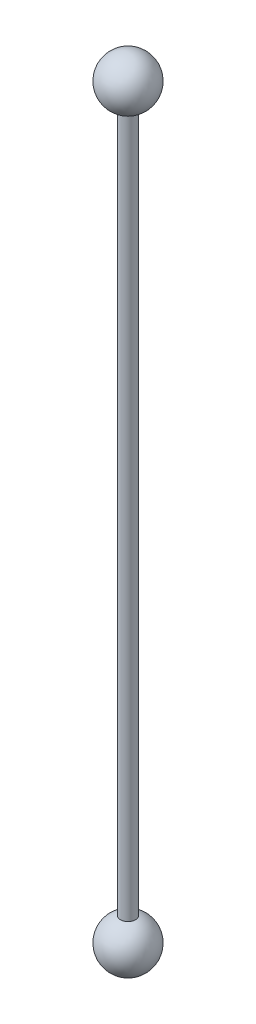
ISO-10303-21;
HEADER;
FILE_DESCRIPTION(('STEP AP214'),'2;1');
FILE_NAME('part.step','',(''),(''),'','','');
FILE_SCHEMA(('AUTOMOTIVE_DESIGN { 1 0 10303 214 1 1 1 1 }'));
ENDSEC;
DATA;
#1=APPLICATION_CONTEXT('core data for automotive mechanical design processes');
#2=APPLICATION_PROTOCOL_DEFINITION('international standard','automotive_design',2000,#1);
#3=PRODUCT_CONTEXT('',#1,'mechanical');
#4=PRODUCT('Part','Part','',(#3));
#5=PRODUCT_RELATED_PRODUCT_CATEGORY('part','',(#4));
#6=PRODUCT_DEFINITION_FORMATION('','',#4);
#7=PRODUCT_DEFINITION_CONTEXT('part definition',#1,'design');
#8=PRODUCT_DEFINITION('design','',#6,#7);
#9=PRODUCT_DEFINITION_SHAPE('','',#8);
#10=(LENGTH_UNIT() NAMED_UNIT(*) SI_UNIT(.MILLI.,.METRE.));
#11=(NAMED_UNIT(*) PLANE_ANGLE_UNIT() SI_UNIT($,.RADIAN.));
#12=(NAMED_UNIT(*) SI_UNIT($,.STERADIAN.) SOLID_ANGLE_UNIT());
#13=UNCERTAINTY_MEASURE_WITH_UNIT(LENGTH_MEASURE(1.E-05),#10,'distance_accuracy_value','');
#14=(GEOMETRIC_REPRESENTATION_CONTEXT(3) GLOBAL_UNCERTAINTY_ASSIGNED_CONTEXT((#13)) GLOBAL_UNIT_ASSIGNED_CONTEXT((#10,
#11,#12)) REPRESENTATION_CONTEXT('',''));
#15=CARTESIAN_POINT('',(0.,0.,0.));
#16=DIRECTION('',(0.,0.,1.));
#17=DIRECTION('',(1.,0.,0.));
#18=AXIS2_PLACEMENT_3D('',#15,#16,#17);
#19=CARTESIAN_POINT('',(0.,150.,0.));
#20=DIRECTION('',(0.,-1.,0.));
#21=DIRECTION('',(0.,0.,-1.));
#22=AXIS2_PLACEMENT_3D('',#19,#20,#21);
#23=CYLINDRICAL_SURFACE('',#22,1.5);
#24=CARTESIAN_POINT('',(0.,4.76969600708473,0.));
#25=DIRECTION('',(0.,-1.,0.));
#26=DIRECTION('',(0.,0.,-1.));
#27=AXIS2_PLACEMENT_3D('',#24,#25,#26);
#28=CIRCLE('',#27,1.5);
#29=CARTESIAN_POINT('',(0.,4.76969600708473,-1.5));
#30=VERTEX_POINT('',#29);
#31=EDGE_CURVE('E44',#30,#30,#28,.T.);
#32=ORIENTED_EDGE('',*,*,#31,.F.);
#33=EDGE_LOOP('',(#32));
#34=FACE_BOUND('',#33,.T.);
#35=CARTESIAN_POINT('',(0.,145.230303992915,0.));
#36=DIRECTION('',(0.,1.,0.));
#37=DIRECTION('',(0.,0.,1.));
#38=AXIS2_PLACEMENT_3D('',#35,#36,#37);
#39=CIRCLE('',#38,1.5);
#40=CARTESIAN_POINT('',(0.,145.230303992915,1.5));
#41=VERTEX_POINT('',#40);
#42=EDGE_CURVE('E10',#41,#41,#39,.T.);
#43=ORIENTED_EDGE('',*,*,#42,.F.);
#44=EDGE_LOOP('',(#43));
#45=FACE_BOUND('',#44,.T.);
#46=ADVANCED_FACE('F37',(#34,#45),#23,.T.);
#47=CARTESIAN_POINT('',(0.,0.,0.));
#48=DIRECTION('',(0.,1.,0.));
#49=DIRECTION('',(0.,0.,-1.));
#50=AXIS2_PLACEMENT_3D('',#47,#48,#49);
#51=SPHERICAL_SURFACE('',#50,5.);
#52=ORIENTED_EDGE('',*,*,#31,.T.);
#53=EDGE_LOOP('',(#52));
#54=FACE_BOUND('',#53,.T.);
#55=ADVANCED_FACE('F51',(#54),#51,.T.);
#56=CARTESIAN_POINT('',(0.,150.,0.));
#57=DIRECTION('',(0.,-1.,0.));
#58=DIRECTION('',(0.,0.,-1.));
#59=AXIS2_PLACEMENT_3D('',#56,#57,#58);
#60=SPHERICAL_SURFACE('',#59,5.);
#61=ORIENTED_EDGE('',*,*,#42,.T.);
#62=EDGE_LOOP('',(#61));
#63=FACE_BOUND('',#62,.T.);
#64=ADVANCED_FACE('F58',(#63),#60,.T.);
#65=CLOSED_SHELL('',(#46,#55,#64));
#66=MANIFOLD_SOLID_BREP('B2',#65);
#67=ADVANCED_BREP_SHAPE_REPRESENTATION('',(#18,#66),#14);
#68=SHAPE_DEFINITION_REPRESENTATION(#9,#67);
ENDSEC;
END-ISO-10303-21;
